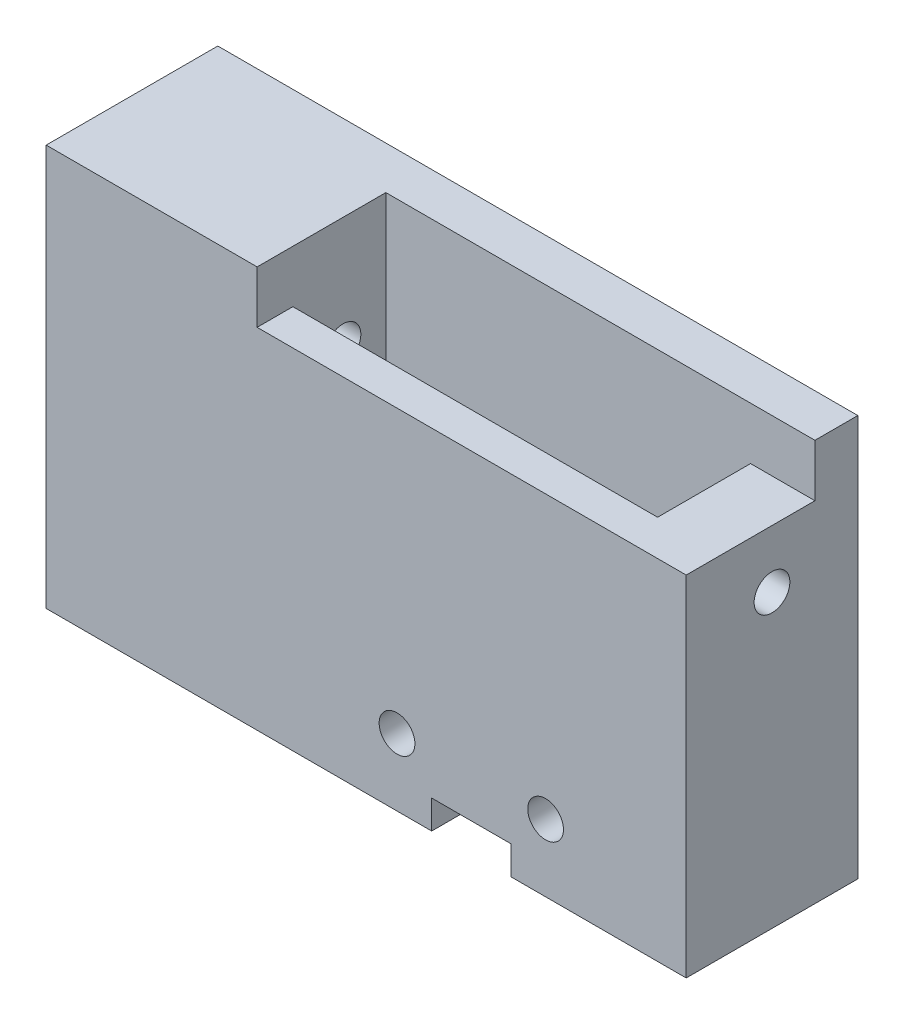
ISO-10303-21;
HEADER;
FILE_DESCRIPTION(('STEP AP214'),'2;1');
FILE_NAME('part.step','',(''),(''),'','','');
FILE_SCHEMA(('AUTOMOTIVE_DESIGN { 1 0 10303 214 1 1 1 1 }'));
ENDSEC;
DATA;
#1=APPLICATION_CONTEXT('core data for automotive mechanical design processes');
#2=APPLICATION_PROTOCOL_DEFINITION('international standard','automotive_design',2000,#1);
#3=PRODUCT_CONTEXT('',#1,'mechanical');
#4=PRODUCT('Part','Part','',(#3));
#5=PRODUCT_RELATED_PRODUCT_CATEGORY('part','',(#4));
#6=PRODUCT_DEFINITION_FORMATION('','',#4);
#7=PRODUCT_DEFINITION_CONTEXT('part definition',#1,'design');
#8=PRODUCT_DEFINITION('design','',#6,#7);
#9=PRODUCT_DEFINITION_SHAPE('','',#8);
#10=(LENGTH_UNIT() NAMED_UNIT(*) SI_UNIT(.MILLI.,.METRE.));
#11=(NAMED_UNIT(*) PLANE_ANGLE_UNIT() SI_UNIT($,.RADIAN.));
#12=(NAMED_UNIT(*) SI_UNIT($,.STERADIAN.) SOLID_ANGLE_UNIT());
#13=UNCERTAINTY_MEASURE_WITH_UNIT(LENGTH_MEASURE(1.E-05),#10,'distance_accuracy_value','');
#14=(GEOMETRIC_REPRESENTATION_CONTEXT(3) GLOBAL_UNCERTAINTY_ASSIGNED_CONTEXT((#13)) GLOBAL_UNIT_ASSIGNED_CONTEXT((#10,
#11,#12)) REPRESENTATION_CONTEXT('',''));
#15=CARTESIAN_POINT('',(0.,0.,0.));
#16=DIRECTION('',(0.,0.,1.));
#17=DIRECTION('',(1.,0.,0.));
#18=AXIS2_PLACEMENT_3D('',#15,#16,#17);
#19=CARTESIAN_POINT('',(-5.28,0.,9.));
#20=DIRECTION('',(1.,0.,0.));
#21=DIRECTION('',(0.,1.,0.));
#22=AXIS2_PLACEMENT_3D('',#19,#20,#21);
#23=PLANE('',#22);
#24=DIRECTION('',(0.,0.,-1.));
#25=VECTOR('',#24,1.);
#26=CARTESIAN_POINT('',(-5.28,6.3,9.));
#27=LINE('',#26,#25);
#28=CARTESIAN_POINT('',(-5.28,6.3,6.5));
#29=VERTEX_POINT('',#28);
#30=CARTESIAN_POINT('',(-5.28,6.3,0.));
#31=VERTEX_POINT('',#30);
#32=EDGE_CURVE('E274',#29,#31,#27,.T.);
#33=ORIENTED_EDGE('',*,*,#32,.F.);
#34=DIRECTION('',(0.,-1.,0.));
#35=VECTOR('',#34,1.);
#36=CARTESIAN_POINT('',(-5.28,0.,6.5));
#37=LINE('',#36,#35);
#38=CARTESIAN_POINT('',(-5.28,-4.7,6.5));
#39=VERTEX_POINT('',#38);
#40=EDGE_CURVE('E196',#29,#39,#37,.T.);
#41=ORIENTED_EDGE('',*,*,#40,.T.);
#42=DIRECTION('',(0.,0.,-1.));
#43=VECTOR('',#42,1.);
#44=CARTESIAN_POINT('',(-5.28,-4.7,9.));
#45=LINE('',#44,#43);
#46=CARTESIAN_POINT('',(-5.28,-4.7,0.));
#47=VERTEX_POINT('',#46);
#48=EDGE_CURVE('E173',#39,#47,#45,.T.);
#49=ORIENTED_EDGE('',*,*,#48,.T.);
#50=DIRECTION('',(0.,-1.,0.));
#51=VECTOR('',#50,1.);
#52=CARTESIAN_POINT('',(-5.28,0.,0.));
#53=LINE('',#52,#51);
#54=EDGE_CURVE('E263',#31,#47,#53,.T.);
#55=ORIENTED_EDGE('',*,*,#54,.F.);
#56=EDGE_LOOP('',(#33,#41,#49,#55));
#57=FACE_BOUND('',#56,.T.);
#58=ADVANCED_FACE('F35',(#57),#23,.T.);
#59=CARTESIAN_POINT('',(0.,6.3,9.));
#60=DIRECTION('',(0.,-1.,0.));
#61=DIRECTION('',(1.,0.,0.));
#62=AXIS2_PLACEMENT_3D('',#59,#60,#61);
#63=PLANE('',#62);
#64=DIRECTION('',(-1.,0.,0.));
#65=VECTOR('',#64,1.);
#66=CARTESIAN_POINT('',(0.,6.3,6.5));
#67=LINE('',#66,#65);
#68=CARTESIAN_POINT('',(-9.78,6.3,6.5));
#69=VERTEX_POINT('',#68);
#70=EDGE_CURVE('E194',#29,#69,#67,.T.);
#71=ORIENTED_EDGE('',*,*,#70,.F.);
#72=ORIENTED_EDGE('',*,*,#32,.T.);
#73=DIRECTION('',(-1.,0.,0.));
#74=VECTOR('',#73,1.);
#75=CARTESIAN_POINT('',(0.,6.3,0.));
#76=LINE('',#75,#74);
#77=CARTESIAN_POINT('',(-9.78,6.3,0.));
#78=VERTEX_POINT('',#77);
#79=EDGE_CURVE('E266',#31,#78,#76,.T.);
#80=ORIENTED_EDGE('',*,*,#79,.T.);
#81=DIRECTION('',(0.,0.,-1.));
#82=VECTOR('',#81,1.);
#83=CARTESIAN_POINT('',(-9.78,6.3,9.));
#84=LINE('',#83,#82);
#85=EDGE_CURVE('E272',#69,#78,#84,.T.);
#86=ORIENTED_EDGE('',*,*,#85,.F.);
#87=EDGE_LOOP('',(#71,#72,#80,#86));
#88=FACE_BOUND('',#87,.T.);
#89=ADVANCED_FACE('F324',(#88),#63,.F.);
#90=CARTESIAN_POINT('',(15.72,0.,9.));
#91=DIRECTION('',(-1.,0.,0.));
#92=DIRECTION('',(0.,-1.,0.));
#93=AXIS2_PLACEMENT_3D('',#90,#91,#92);
#94=PLANE('',#93);
#95=CARTESIAN_POINT('',(15.72,15.66,3.));
#96=DIRECTION('',(-1.,0.,0.));
#97=DIRECTION('',(0.,-1.,0.));
#98=AXIS2_PLACEMENT_3D('',#95,#96,#97);
#99=CIRCLE('',#98,1.25);
#100=CARTESIAN_POINT('',(15.72,14.41,3.));
#101=VERTEX_POINT('',#100);
#102=EDGE_CURVE('E227',#101,#101,#99,.T.);
#103=ORIENTED_EDGE('',*,*,#102,.F.);
#104=EDGE_LOOP('',(#103));
#105=FACE_BOUND('',#104,.T.);
#106=DIRECTION('',(0.,0.,-1.));
#107=VECTOR('',#106,1.);
#108=CARTESIAN_POINT('',(15.72,-4.7,9.));
#109=LINE('',#108,#107);
#110=CARTESIAN_POINT('',(15.72,-4.7,6.5));
#111=VERTEX_POINT('',#110);
#112=CARTESIAN_POINT('',(15.72,-4.7,0.));
#113=VERTEX_POINT('',#112);
#114=EDGE_CURVE('E51',#111,#113,#109,.T.);
#115=ORIENTED_EDGE('',*,*,#114,.F.);
#116=DIRECTION('',(0.,1.,0.));
#117=VECTOR('',#116,1.);
#118=CARTESIAN_POINT('',(15.72,0.,6.5));
#119=LINE('',#118,#117);
#120=CARTESIAN_POINT('',(15.72,19.7,6.5));
#121=VERTEX_POINT('',#120);
#122=EDGE_CURVE('E55',#111,#121,#119,.T.);
#123=ORIENTED_EDGE('',*,*,#122,.T.);
#124=DIRECTION('',(0.,0.,-1.));
#125=VECTOR('',#124,1.);
#126=CARTESIAN_POINT('',(15.72,19.7,9.));
#127=LINE('',#126,#125);
#128=CARTESIAN_POINT('',(15.72,19.7,0.));
#129=VERTEX_POINT('',#128);
#130=EDGE_CURVE('E254',#121,#129,#127,.T.);
#131=ORIENTED_EDGE('',*,*,#130,.T.);
#132=DIRECTION('',(0.,1.,0.));
#133=VECTOR('',#132,1.);
#134=CARTESIAN_POINT('',(15.72,0.,0.));
#135=LINE('',#134,#133);
#136=EDGE_CURVE('E234',#113,#129,#135,.T.);
#137=ORIENTED_EDGE('',*,*,#136,.F.);
#138=EDGE_LOOP('',(#115,#123,#131,#137));
#139=FACE_BOUND('',#138,.T.);
#140=ADVANCED_FACE('F357',(#105,#139),#94,.T.);
#141=CARTESIAN_POINT('',(0.,0.,0.));
#142=DIRECTION('',(0.,0.,1.));
#143=DIRECTION('',(1.,0.,0.));
#144=AXIS2_PLACEMENT_3D('',#141,#142,#143);
#145=PLANE('',#144);
#146=CARTESIAN_POINT('',(0.,0.,0.));
#147=DIRECTION('',(0.,0.,1.));
#148=DIRECTION('',(1.,0.,0.));
#149=AXIS2_PLACEMENT_3D('',#146,#147,#148);
#150=CIRCLE('',#149,1.25);
#151=CARTESIAN_POINT('',(1.25,0.,0.));
#152=VERTEX_POINT('',#151);
#153=EDGE_CURVE('E292',#152,#152,#150,.T.);
#154=ORIENTED_EDGE('',*,*,#153,.F.);
#155=EDGE_LOOP('',(#154));
#156=FACE_BOUND('',#155,.T.);
#157=CARTESIAN_POINT('',(10.39,0.,0.));
#158=DIRECTION('',(0.,0.,1.));
#159=DIRECTION('',(1.,0.,0.));
#160=AXIS2_PLACEMENT_3D('',#157,#158,#159);
#161=CIRCLE('',#160,1.25);
#162=CARTESIAN_POINT('',(11.64,0.,0.));
#163=VERTEX_POINT('',#162);
#164=EDGE_CURVE('E284',#163,#163,#161,.T.);
#165=ORIENTED_EDGE('',*,*,#164,.F.);
#166=EDGE_LOOP('',(#165));
#167=FACE_BOUND('',#166,.T.);
#168=DIRECTION('',(1.,0.,0.));
#169=VECTOR('',#168,1.);
#170=CARTESIAN_POINT('',(0.,23.36,0.));
#171=LINE('',#170,#169);
#172=CARTESIAN_POINT('',(-9.78,23.36,0.));
#173=VERTEX_POINT('',#172);
#174=CARTESIAN_POINT('',(20.22,23.36,0.));
#175=VERTEX_POINT('',#174);
#176=EDGE_CURVE('E276',#173,#175,#171,.T.);
#177=ORIENTED_EDGE('',*,*,#176,.F.);
#178=DIRECTION('',(0.,1.,0.));
#179=VECTOR('',#178,1.);
#180=CARTESIAN_POINT('',(-9.78,0.,0.));
#181=LINE('',#180,#179);
#182=EDGE_CURVE('E231',#78,#173,#181,.T.);
#183=ORIENTED_EDGE('',*,*,#182,.F.);
#184=ORIENTED_EDGE('',*,*,#79,.F.);
#185=ORIENTED_EDGE('',*,*,#54,.T.);
#186=DIRECTION('',(-1.,0.,0.));
#187=VECTOR('',#186,1.);
#188=CARTESIAN_POINT('',(0.,-4.7,0.));
#189=LINE('',#188,#187);
#190=EDGE_CURVE('E307',#113,#47,#189,.T.);
#191=ORIENTED_EDGE('',*,*,#190,.F.);
#192=ORIENTED_EDGE('',*,*,#136,.T.);
#193=DIRECTION('',(1.,0.,0.));
#194=VECTOR('',#193,1.);
#195=CARTESIAN_POINT('',(0.,19.7,0.));
#196=LINE('',#195,#194);
#197=CARTESIAN_POINT('',(20.22,19.7,0.));
#198=VERTEX_POINT('',#197);
#199=EDGE_CURVE('E248',#129,#198,#196,.T.);
#200=ORIENTED_EDGE('',*,*,#199,.T.);
#201=DIRECTION('',(0.,-1.,0.));
#202=VECTOR('',#201,1.);
#203=CARTESIAN_POINT('',(20.22,0.,0.));
#204=LINE('',#203,#202);
#205=EDGE_CURVE('E303',#175,#198,#204,.T.);
#206=ORIENTED_EDGE('',*,*,#205,.F.);
#207=EDGE_LOOP('',(#177,#183,#184,#185,#191,#192,#200,#206));
#208=FACE_BOUND('',#207,.T.);
#209=ADVANCED_FACE('F316',(#156,#167,#208),#145,.T.);
#210=CARTESIAN_POINT('',(20.22,0.,-3.));
#211=DIRECTION('',(-1.,0.,0.));
#212=DIRECTION('',(0.,0.,1.));
#213=AXIS2_PLACEMENT_3D('',#210,#211,#212);
#214=PLANE('',#213);
#215=CARTESIAN_POINT('',(20.22,15.66,3.));
#216=DIRECTION('',(-1.,0.,0.));
#217=DIRECTION('',(0.,0.,1.));
#218=AXIS2_PLACEMENT_3D('',#215,#216,#217);
#219=CIRCLE('',#218,1.25);
#220=CARTESIAN_POINT('',(20.22,15.66,4.25));
#221=VERTEX_POINT('',#220);
#222=EDGE_CURVE('E224',#221,#221,#219,.T.);
#223=ORIENTED_EDGE('',*,*,#222,.T.);
#224=EDGE_LOOP('',(#223));
#225=FACE_BOUND('',#224,.T.);
#226=ORIENTED_EDGE('',*,*,#205,.T.);
#227=DIRECTION('',(0.,0.,-1.));
#228=VECTOR('',#227,1.);
#229=CARTESIAN_POINT('',(20.22,19.7,9.));
#230=LINE('',#229,#228);
#231=CARTESIAN_POINT('',(20.22,19.7,9.));
#232=VERTEX_POINT('',#231);
#233=EDGE_CURVE('E260',#232,#198,#230,.T.);
#234=ORIENTED_EDGE('',*,*,#233,.F.);
#235=DIRECTION('',(0.,-1.,0.));
#236=VECTOR('',#235,1.);
#237=CARTESIAN_POINT('',(20.22,0.,9.));
#238=LINE('',#237,#236);
#239=CARTESIAN_POINT('',(20.22,-4.7,9.));
#240=VERTEX_POINT('',#239);
#241=EDGE_CURVE('E247',#232,#240,#238,.T.);
#242=ORIENTED_EDGE('',*,*,#241,.T.);
#243=DIRECTION('',(0.,0.,1.));
#244=VECTOR('',#243,1.);
#245=CARTESIAN_POINT('',(20.22,-4.7,-3.));
#246=LINE('',#245,#244);
#247=CARTESIAN_POINT('',(20.22,-4.7,-3.));
#248=VERTEX_POINT('',#247);
#249=EDGE_CURVE('E11',#248,#240,#246,.T.);
#250=ORIENTED_EDGE('',*,*,#249,.F.);
#251=DIRECTION('',(0.,-1.,0.));
#252=VECTOR('',#251,1.);
#253=CARTESIAN_POINT('',(20.22,0.,-3.));
#254=LINE('',#253,#252);
#255=CARTESIAN_POINT('',(20.22,23.36,-3.));
#256=VERTEX_POINT('',#255);
#257=EDGE_CURVE('E304',#256,#248,#254,.T.);
#258=ORIENTED_EDGE('',*,*,#257,.F.);
#259=DIRECTION('',(0.,0.,1.));
#260=VECTOR('',#259,1.);
#261=CARTESIAN_POINT('',(20.22,23.36,-55.8197510406855));
#262=LINE('',#261,#260);
#263=EDGE_CURVE('E286',#256,#175,#262,.T.);
#264=ORIENTED_EDGE('',*,*,#263,.T.);
#265=EDGE_LOOP('',(#226,#234,#242,#250,#258,#264));
#266=FACE_BOUND('',#265,.T.);
#267=ADVANCED_FACE('F37',(#225,#266),#214,.F.);
#268=CARTESIAN_POINT('',(0.,-4.7,-3.));
#269=DIRECTION('',(0.,1.,0.));
#270=DIRECTION('',(-1.,0.,0.));
#271=AXIS2_PLACEMENT_3D('',#268,#269,#270);
#272=PLANE('',#271);
#273=DIRECTION('',(-1.,0.,0.));
#274=VECTOR('',#273,1.);
#275=CARTESIAN_POINT('',(0.,-4.7,9.));
#276=LINE('',#275,#274);
#277=CARTESIAN_POINT('',(2.425,-4.7,9.));
#278=VERTEX_POINT('',#277);
#279=CARTESIAN_POINT('',(-24.5299999999999,-4.7,9.));
#280=VERTEX_POINT('',#279);
#281=EDGE_CURVE('E264',#278,#280,#276,.T.);
#282=ORIENTED_EDGE('',*,*,#281,.T.);
#283=DIRECTION('',(0.,0.,1.));
#284=VECTOR('',#283,1.);
#285=CARTESIAN_POINT('',(-24.5299999999999,-4.7,-55.8197510406855));
#286=LINE('',#285,#284);
#287=CARTESIAN_POINT('',(-24.5299999999999,-4.7,-3.));
#288=VERTEX_POINT('',#287);
#289=EDGE_CURVE('E281',#288,#280,#286,.T.);
#290=ORIENTED_EDGE('',*,*,#289,.F.);
#291=DIRECTION('',(-1.,0.,0.));
#292=VECTOR('',#291,1.);
#293=CARTESIAN_POINT('',(0.,-4.7,-3.));
#294=LINE('',#293,#292);
#295=EDGE_CURVE('E44',#248,#288,#294,.T.);
#296=ORIENTED_EDGE('',*,*,#295,.F.);
#297=ORIENTED_EDGE('',*,*,#249,.T.);
#298=DIRECTION('',(-1.,0.,0.));
#299=VECTOR('',#298,1.);
#300=CARTESIAN_POINT('',(0.,-4.7,9.));
#301=LINE('',#300,#299);
#302=CARTESIAN_POINT('',(7.975,-4.7,9.));
#303=VERTEX_POINT('',#302);
#304=EDGE_CURVE('E245',#240,#303,#301,.T.);
#305=ORIENTED_EDGE('',*,*,#304,.T.);
#306=DIRECTION('',(0.,0.,-1.));
#307=VECTOR('',#306,1.);
#308=CARTESIAN_POINT('',(7.975,-4.7,44.2932004782791));
#309=LINE('',#308,#307);
#310=CARTESIAN_POINT('',(7.975,-4.7,6.5));
#311=VERTEX_POINT('',#310);
#312=EDGE_CURVE('E207',#303,#311,#309,.T.);
#313=ORIENTED_EDGE('',*,*,#312,.T.);
#314=DIRECTION('',(-1.,0.,0.));
#315=VECTOR('',#314,1.);
#316=CARTESIAN_POINT('',(0.,-4.7,6.5));
#317=LINE('',#316,#315);
#318=EDGE_CURVE('E184',#111,#311,#317,.T.);
#319=ORIENTED_EDGE('',*,*,#318,.F.);
#320=ORIENTED_EDGE('',*,*,#114,.T.);
#321=ORIENTED_EDGE('',*,*,#190,.T.);
#322=ORIENTED_EDGE('',*,*,#48,.F.);
#323=DIRECTION('',(-1.,0.,0.));
#324=VECTOR('',#323,1.);
#325=CARTESIAN_POINT('',(0.,-4.7,6.5));
#326=LINE('',#325,#324);
#327=CARTESIAN_POINT('',(2.425,-4.7,6.5));
#328=VERTEX_POINT('',#327);
#329=EDGE_CURVE('E164',#328,#39,#326,.T.);
#330=ORIENTED_EDGE('',*,*,#329,.F.);
#331=DIRECTION('',(0.,0.,-1.));
#332=VECTOR('',#331,1.);
#333=CARTESIAN_POINT('',(2.425,-4.7,44.2932004782791));
#334=LINE('',#333,#332);
#335=EDGE_CURVE('E147',#278,#328,#334,.T.);
#336=ORIENTED_EDGE('',*,*,#335,.F.);
#337=EDGE_LOOP('',(#282,#290,#296,#297,#305,#313,#319,#320,#321,#322,#330,#336));
#338=FACE_BOUND('',#337,.T.);
#339=ADVANCED_FACE('F171',(#338),#272,.F.);
#340=CARTESIAN_POINT('',(0.,0.,-3.));
#341=DIRECTION('',(0.,0.,1.));
#342=DIRECTION('',(1.,0.,0.));
#343=AXIS2_PLACEMENT_3D('',#340,#341,#342);
#344=PLANE('',#343);
#345=DIRECTION('',(-1.,0.,0.));
#346=VECTOR('',#345,1.);
#347=CARTESIAN_POINT('',(0.,23.36,-3.));
#348=LINE('',#347,#346);
#349=CARTESIAN_POINT('',(-24.5299999999999,23.36,-3.));
#350=VERTEX_POINT('',#349);
#351=EDGE_CURVE('E277',#256,#350,#348,.T.);
#352=ORIENTED_EDGE('',*,*,#351,.F.);
#353=ORIENTED_EDGE('',*,*,#257,.T.);
#354=ORIENTED_EDGE('',*,*,#295,.T.);
#355=DIRECTION('',(0.,-1.,0.));
#356=VECTOR('',#355,1.);
#357=CARTESIAN_POINT('',(-24.5299999999999,0.,-3.));
#358=LINE('',#357,#356);
#359=EDGE_CURVE('E280',#350,#288,#358,.T.);
#360=ORIENTED_EDGE('',*,*,#359,.F.);
#361=EDGE_LOOP('',(#352,#353,#354,#360));
#362=FACE_BOUND('',#361,.T.);
#363=CARTESIAN_POINT('',(10.39,0.,-3.));
#364=DIRECTION('',(0.,0.,1.));
#365=DIRECTION('',(1.,0.,0.));
#366=AXIS2_PLACEMENT_3D('',#363,#364,#365);
#367=CIRCLE('',#366,1.25);
#368=CARTESIAN_POINT('',(11.64,0.,-3.));
#369=VERTEX_POINT('',#368);
#370=EDGE_CURVE('E295',#369,#369,#367,.T.);
#371=ORIENTED_EDGE('',*,*,#370,.T.);
#372=EDGE_LOOP('',(#371));
#373=FACE_BOUND('',#372,.T.);
#374=CARTESIAN_POINT('',(0.,0.,-3.));
#375=DIRECTION('',(0.,0.,1.));
#376=DIRECTION('',(1.,0.,0.));
#377=AXIS2_PLACEMENT_3D('',#374,#375,#376);
#378=CIRCLE('',#377,1.25);
#379=CARTESIAN_POINT('',(1.25,0.,-3.));
#380=VERTEX_POINT('',#379);
#381=EDGE_CURVE('E300',#380,#380,#378,.T.);
#382=ORIENTED_EDGE('',*,*,#381,.T.);
#383=EDGE_LOOP('',(#382));
#384=FACE_BOUND('',#383,.T.);
#385=ADVANCED_FACE('F389',(#362,#373,#384),#344,.F.);
#386=CARTESIAN_POINT('',(10.39,0.,-6.));
#387=DIRECTION('',(0.,0.,1.));
#388=DIRECTION('',(1.,0.,0.));
#389=AXIS2_PLACEMENT_3D('',#386,#387,#388);
#390=CYLINDRICAL_SURFACE('',#389,1.25);
#391=ORIENTED_EDGE('',*,*,#164,.T.);
#392=EDGE_LOOP('',(#391));
#393=FACE_BOUND('',#392,.T.);
#394=ORIENTED_EDGE('',*,*,#370,.F.);
#395=EDGE_LOOP('',(#394));
#396=FACE_BOUND('',#395,.T.);
#397=ADVANCED_FACE('F385',(#393,#396),#390,.F.);
#398=CARTESIAN_POINT('',(0.,0.,-6.));
#399=DIRECTION('',(0.,0.,1.));
#400=DIRECTION('',(1.,0.,0.));
#401=AXIS2_PLACEMENT_3D('',#398,#399,#400);
#402=CYLINDRICAL_SURFACE('',#401,1.25);
#403=ORIENTED_EDGE('',*,*,#153,.T.);
#404=EDGE_LOOP('',(#403));
#405=FACE_BOUND('',#404,.T.);
#406=ORIENTED_EDGE('',*,*,#381,.F.);
#407=EDGE_LOOP('',(#406));
#408=FACE_BOUND('',#407,.T.);
#409=ADVANCED_FACE('F382',(#405,#408),#402,.F.);
#410=CARTESIAN_POINT('',(0.,23.36,-55.8197510406855));
#411=DIRECTION('',(0.,-1.,0.));
#412=DIRECTION('',(0.,0.,-1.));
#413=AXIS2_PLACEMENT_3D('',#410,#411,#412);
#414=PLANE('',#413);
#415=ORIENTED_EDGE('',*,*,#263,.F.);
#416=ORIENTED_EDGE('',*,*,#351,.T.);
#417=DIRECTION('',(0.,0.,1.));
#418=VECTOR('',#417,1.);
#419=CARTESIAN_POINT('',(-24.5299999999999,23.36,-55.8197510406855));
#420=LINE('',#419,#418);
#421=CARTESIAN_POINT('',(-24.5299999999999,23.36,9.));
#422=VERTEX_POINT('',#421);
#423=EDGE_CURVE('E288',#350,#422,#420,.T.);
#424=ORIENTED_EDGE('',*,*,#423,.T.);
#425=DIRECTION('',(1.,0.,0.));
#426=VECTOR('',#425,1.);
#427=CARTESIAN_POINT('',(0.,23.36,9.));
#428=LINE('',#427,#426);
#429=CARTESIAN_POINT('',(-9.78,23.36,9.));
#430=VERTEX_POINT('',#429);
#431=EDGE_CURVE('E239',#422,#430,#428,.T.);
#432=ORIENTED_EDGE('',*,*,#431,.T.);
#433=DIRECTION('',(0.,0.,-1.));
#434=VECTOR('',#433,1.);
#435=CARTESIAN_POINT('',(-9.78,23.36,40.7005693955171));
#436=LINE('',#435,#434);
#437=EDGE_CURVE('E235',#430,#173,#436,.T.);
#438=ORIENTED_EDGE('',*,*,#437,.T.);
#439=ORIENTED_EDGE('',*,*,#176,.T.);
#440=EDGE_LOOP('',(#415,#416,#424,#432,#438,#439));
#441=FACE_BOUND('',#440,.T.);
#442=ADVANCED_FACE('F332',(#441),#414,.F.);
#443=CARTESIAN_POINT('',(-24.5299999999999,0.,-55.8197510406855));
#444=DIRECTION('',(1.,0.,0.));
#445=DIRECTION('',(0.,0.,-1.));
#446=AXIS2_PLACEMENT_3D('',#443,#444,#445);
#447=PLANE('',#446);
#448=CARTESIAN_POINT('',(-24.5299999999999,15.66,3.));
#449=DIRECTION('',(-1.,0.,0.));
#450=DIRECTION('',(0.,0.,1.));
#451=AXIS2_PLACEMENT_3D('',#448,#449,#450);
#452=CIRCLE('',#451,5.);
#453=CARTESIAN_POINT('',(-24.5299999999999,15.66,8.));
#454=VERTEX_POINT('',#453);
#455=EDGE_CURVE('E158',#454,#454,#452,.T.);
#456=ORIENTED_EDGE('',*,*,#455,.F.);
#457=EDGE_LOOP('',(#456));
#458=FACE_BOUND('',#457,.T.);
#459=ORIENTED_EDGE('',*,*,#423,.F.);
#460=ORIENTED_EDGE('',*,*,#359,.T.);
#461=ORIENTED_EDGE('',*,*,#289,.T.);
#462=DIRECTION('',(0.,1.,0.));
#463=VECTOR('',#462,1.);
#464=CARTESIAN_POINT('',(-24.5299999999999,0.,9.));
#465=LINE('',#464,#463);
#466=EDGE_CURVE('E236',#280,#422,#465,.T.);
#467=ORIENTED_EDGE('',*,*,#466,.T.);
#468=EDGE_LOOP('',(#459,#460,#461,#467));
#469=FACE_BOUND('',#468,.T.);
#470=ADVANCED_FACE('F376',(#458,#469),#447,.F.);
#471=CARTESIAN_POINT('',(0.,0.,9.));
#472=DIRECTION('',(0.,0.,1.));
#473=DIRECTION('',(1.,0.,0.));
#474=AXIS2_PLACEMENT_3D('',#471,#472,#473);
#475=PLANE('',#474);
#476=ORIENTED_EDGE('',*,*,#281,.F.);
#477=DIRECTION('',(0.,1.,0.));
#478=VECTOR('',#477,1.);
#479=CARTESIAN_POINT('',(2.425,0.,9.));
#480=LINE('',#479,#478);
#481=CARTESIAN_POINT('',(2.425,-2.7,9.));
#482=VERTEX_POINT('',#481);
#483=EDGE_CURVE('E154',#278,#482,#480,.T.);
#484=ORIENTED_EDGE('',*,*,#483,.T.);
#485=DIRECTION('',(1.,0.,0.));
#486=VECTOR('',#485,1.);
#487=CARTESIAN_POINT('',(0.,-2.7,9.));
#488=LINE('',#487,#486);
#489=CARTESIAN_POINT('',(7.975,-2.7,9.));
#490=VERTEX_POINT('',#489);
#491=EDGE_CURVE('E352',#482,#490,#488,.T.);
#492=ORIENTED_EDGE('',*,*,#491,.T.);
#493=DIRECTION('',(0.,-1.,0.));
#494=VECTOR('',#493,1.);
#495=CARTESIAN_POINT('',(7.975,0.,9.));
#496=LINE('',#495,#494);
#497=EDGE_CURVE('E215',#490,#303,#496,.T.);
#498=ORIENTED_EDGE('',*,*,#497,.T.);
#499=ORIENTED_EDGE('',*,*,#304,.F.);
#500=ORIENTED_EDGE('',*,*,#241,.F.);
#501=DIRECTION('',(1.,0.,0.));
#502=VECTOR('',#501,1.);
#503=CARTESIAN_POINT('',(0.,19.7,9.));
#504=LINE('',#503,#502);
#505=CARTESIAN_POINT('',(-9.78,19.7,9.));
#506=VERTEX_POINT('',#505);
#507=EDGE_CURVE('E251',#506,#232,#504,.T.);
#508=ORIENTED_EDGE('',*,*,#507,.F.);
#509=DIRECTION('',(0.,1.,0.));
#510=VECTOR('',#509,1.);
#511=CARTESIAN_POINT('',(-9.78,0.,9.));
#512=LINE('',#511,#510);
#513=EDGE_CURVE('E230',#506,#430,#512,.T.);
#514=ORIENTED_EDGE('',*,*,#513,.T.);
#515=ORIENTED_EDGE('',*,*,#431,.F.);
#516=ORIENTED_EDGE('',*,*,#466,.F.);
#517=EDGE_LOOP('',(#476,#484,#492,#498,#499,#500,#508,#514,#515,#516));
#518=FACE_BOUND('',#517,.T.);
#519=CARTESIAN_POINT('',(10.39,0.,9.));
#520=DIRECTION('',(0.,0.,1.));
#521=DIRECTION('',(1.,0.,0.));
#522=AXIS2_PLACEMENT_3D('',#519,#520,#521);
#523=CIRCLE('',#522,1.25);
#524=CARTESIAN_POINT('',(11.64,0.,9.));
#525=VERTEX_POINT('',#524);
#526=EDGE_CURVE('E174',#525,#525,#523,.T.);
#527=ORIENTED_EDGE('',*,*,#526,.F.);
#528=EDGE_LOOP('',(#527));
#529=FACE_BOUND('',#528,.T.);
#530=CARTESIAN_POINT('',(0.,0.,9.));
#531=DIRECTION('',(0.,0.,1.));
#532=DIRECTION('',(1.,0.,0.));
#533=AXIS2_PLACEMENT_3D('',#530,#531,#532);
#534=CIRCLE('',#533,1.25);
#535=CARTESIAN_POINT('',(1.25,0.,9.));
#536=VERTEX_POINT('',#535);
#537=EDGE_CURVE('E212',#536,#536,#534,.T.);
#538=ORIENTED_EDGE('',*,*,#537,.F.);
#539=EDGE_LOOP('',(#538));
#540=FACE_BOUND('',#539,.T.);
#541=ADVANCED_FACE('F336',(#518,#529,#540),#475,.T.);
#542=CARTESIAN_POINT('',(0.,19.7,9.));
#543=DIRECTION('',(0.,1.,0.));
#544=DIRECTION('',(0.,0.,1.));
#545=AXIS2_PLACEMENT_3D('',#542,#543,#544);
#546=PLANE('',#545);
#547=ORIENTED_EDGE('',*,*,#199,.F.);
#548=ORIENTED_EDGE('',*,*,#130,.F.);
#549=DIRECTION('',(1.,0.,0.));
#550=VECTOR('',#549,1.);
#551=CARTESIAN_POINT('',(0.,19.7,6.5));
#552=LINE('',#551,#550);
#553=CARTESIAN_POINT('',(-9.78,19.7,6.5));
#554=VERTEX_POINT('',#553);
#555=EDGE_CURVE('E188',#554,#121,#552,.T.);
#556=ORIENTED_EDGE('',*,*,#555,.F.);
#557=DIRECTION('',(0.,0.,-1.));
#558=VECTOR('',#557,1.);
#559=CARTESIAN_POINT('',(-9.78,19.7,44.2932004782791));
#560=LINE('',#559,#558);
#561=EDGE_CURVE('E204',#506,#554,#560,.T.);
#562=ORIENTED_EDGE('',*,*,#561,.F.);
#563=ORIENTED_EDGE('',*,*,#507,.T.);
#564=ORIENTED_EDGE('',*,*,#233,.T.);
#565=EDGE_LOOP('',(#547,#548,#556,#562,#563,#564));
#566=FACE_BOUND('',#565,.T.);
#567=ADVANCED_FACE('F343',(#566),#546,.T.);
#568=CARTESIAN_POINT('',(-9.78,0.,40.7005693955171));
#569=DIRECTION('',(-1.,0.,0.));
#570=DIRECTION('',(0.,0.,1.));
#571=AXIS2_PLACEMENT_3D('',#568,#569,#570);
#572=PLANE('',#571);
#573=CARTESIAN_POINT('',(-9.78,15.66,3.));
#574=DIRECTION('',(-1.,0.,0.));
#575=DIRECTION('',(0.,0.,1.));
#576=AXIS2_PLACEMENT_3D('',#573,#574,#575);
#577=CIRCLE('',#576,1.25);
#578=CARTESIAN_POINT('',(-9.78,15.66,4.25));
#579=VERTEX_POINT('',#578);
#580=EDGE_CURVE('E39',#579,#579,#577,.T.);
#581=ORIENTED_EDGE('',*,*,#580,.T.);
#582=EDGE_LOOP('',(#581));
#583=FACE_BOUND('',#582,.T.);
#584=ORIENTED_EDGE('',*,*,#513,.F.);
#585=ORIENTED_EDGE('',*,*,#561,.T.);
#586=DIRECTION('',(0.,1.,0.));
#587=VECTOR('',#586,1.);
#588=CARTESIAN_POINT('',(-9.78,0.,6.5));
#589=LINE('',#588,#587);
#590=EDGE_CURVE('E191',#69,#554,#589,.T.);
#591=ORIENTED_EDGE('',*,*,#590,.F.);
#592=ORIENTED_EDGE('',*,*,#85,.T.);
#593=ORIENTED_EDGE('',*,*,#182,.T.);
#594=ORIENTED_EDGE('',*,*,#437,.F.);
#595=EDGE_LOOP('',(#584,#585,#591,#592,#593,#594));
#596=FACE_BOUND('',#595,.T.);
#597=ADVANCED_FACE('F327',(#583,#596),#572,.F.);
#598=CARTESIAN_POINT('',(-13.5279670038566,15.66,3.));
#599=DIRECTION('',(-1.,0.,0.));
#600=DIRECTION('',(0.,0.,1.));
#601=AXIS2_PLACEMENT_3D('',#598,#599,#600);
#602=CYLINDRICAL_SURFACE('',#601,5.);
#603=CARTESIAN_POINT('',(-18.5299999999999,15.66,3.));
#604=DIRECTION('',(-1.,0.,0.));
#605=DIRECTION('',(0.,0.,1.));
#606=AXIS2_PLACEMENT_3D('',#603,#604,#605);
#607=CIRCLE('',#606,5.);
#608=CARTESIAN_POINT('',(-18.5299999999999,15.66,8.));
#609=VERTEX_POINT('',#608);
#610=EDGE_CURVE('E218',#609,#609,#607,.T.);
#611=ORIENTED_EDGE('',*,*,#610,.F.);
#612=EDGE_LOOP('',(#611));
#613=FACE_BOUND('',#612,.T.);
#614=ORIENTED_EDGE('',*,*,#455,.T.);
#615=EDGE_LOOP('',(#614));
#616=FACE_BOUND('',#615,.T.);
#617=ADVANCED_FACE('F420',(#613,#616),#602,.F.);
#618=CARTESIAN_POINT('',(-18.5299999999999,15.66,3.));
#619=DIRECTION('',(-1.,0.,0.));
#620=DIRECTION('',(0.,0.,1.));
#621=AXIS2_PLACEMENT_3D('',#618,#619,#620);
#622=CONICAL_SURFACE('',#621,5.,0.785398163397459);
#623=CARTESIAN_POINT('',(-14.78,15.66,3.));
#624=DIRECTION('',(-1.,0.,0.));
#625=DIRECTION('',(0.,0.,1.));
#626=AXIS2_PLACEMENT_3D('',#623,#624,#625);
#627=CIRCLE('',#626,1.24999999999999);
#628=CARTESIAN_POINT('',(-14.78,15.66,4.24999999999999));
#629=VERTEX_POINT('',#628);
#630=EDGE_CURVE('E221',#629,#629,#627,.T.);
#631=CARTESIAN_POINT('',(-14.78,15.66,4.24999999999999));
#632=CARTESIAN_POINT('',(-14.8190625,15.66,4.28906249999999));
#633=CARTESIAN_POINT('',(-14.858125,15.66,4.32812499999999));
#634=CARTESIAN_POINT('',(-14.93625,15.66,4.40624999999999));
#635=CARTESIAN_POINT('',(-14.9753125,15.66,4.44531249999999));
#636=CARTESIAN_POINT('',(-15.0534375,15.66,4.52343749999999));
#637=CARTESIAN_POINT('',(-15.0925,15.66,4.56249999999999));
#638=CARTESIAN_POINT('',(-15.170625,15.66,4.64062499999999));
#639=CARTESIAN_POINT('',(-15.2096875,15.66,4.67968749999999));
#640=CARTESIAN_POINT('',(-15.2878125,15.66,4.75781249999999));
#641=CARTESIAN_POINT('',(-15.326875,15.66,4.79687499999999));
#642=CARTESIAN_POINT('',(-15.405,15.66,4.87499999999999));
#643=CARTESIAN_POINT('',(-15.4440625,15.66,4.91406249999999));
#644=CARTESIAN_POINT('',(-15.5221875,15.66,4.99218749999999));
#645=CARTESIAN_POINT('',(-15.56125,15.66,5.03124999999999));
#646=CARTESIAN_POINT('',(-15.639375,15.66,5.10937499999999));
#647=CARTESIAN_POINT('',(-15.6784375,15.66,5.1484375));
#648=CARTESIAN_POINT('',(-15.7565625,15.66,5.2265625));
#649=CARTESIAN_POINT('',(-15.795625,15.66,5.265625));
#650=CARTESIAN_POINT('',(-15.87375,15.66,5.34375));
#651=CARTESIAN_POINT('',(-15.9128125,15.66,5.3828125));
#652=CARTESIAN_POINT('',(-15.9909375,15.66,5.4609375));
#653=CARTESIAN_POINT('',(-16.03,15.66,5.5));
#654=CARTESIAN_POINT('',(-16.108125,15.66,5.578125));
#655=CARTESIAN_POINT('',(-16.1471875,15.66,5.6171875));
#656=CARTESIAN_POINT('',(-16.2253125,15.66,5.6953125));
#657=CARTESIAN_POINT('',(-16.264375,15.66,5.734375));
#658=CARTESIAN_POINT('',(-16.3425,15.66,5.8125));
#659=CARTESIAN_POINT('',(-16.3815625,15.66,5.8515625));
#660=CARTESIAN_POINT('',(-16.4596875,15.66,5.9296875));
#661=CARTESIAN_POINT('',(-16.49875,15.66,5.96875));
#662=CARTESIAN_POINT('',(-16.576875,15.66,6.046875));
#663=CARTESIAN_POINT('',(-16.6159375,15.66,6.0859375));
#664=CARTESIAN_POINT('',(-16.6940625,15.66,6.1640625));
#665=CARTESIAN_POINT('',(-16.733125,15.66,6.203125));
#666=CARTESIAN_POINT('',(-16.81125,15.66,6.28125));
#667=CARTESIAN_POINT('',(-16.8503125,15.66,6.3203125));
#668=CARTESIAN_POINT('',(-16.9284375,15.66,6.3984375));
#669=CARTESIAN_POINT('',(-16.9675,15.66,6.4375));
#670=CARTESIAN_POINT('',(-17.045625,15.66,6.515625));
#671=CARTESIAN_POINT('',(-17.0846875,15.66,6.5546875));
#672=CARTESIAN_POINT('',(-17.1628125,15.66,6.6328125));
#673=CARTESIAN_POINT('',(-17.201875,15.66,6.671875));
#674=CARTESIAN_POINT('',(-17.28,15.66,6.75));
#675=CARTESIAN_POINT('',(-17.3190625,15.66,6.7890625));
#676=CARTESIAN_POINT('',(-17.3971875,15.66,6.8671875));
#677=CARTESIAN_POINT('',(-17.43625,15.66,6.90625));
#678=CARTESIAN_POINT('',(-17.514375,15.66,6.984375));
#679=CARTESIAN_POINT('',(-17.5534375,15.66,7.0234375));
#680=CARTESIAN_POINT('',(-17.6315625,15.66,7.1015625));
#681=CARTESIAN_POINT('',(-17.670625,15.66,7.140625));
#682=CARTESIAN_POINT('',(-17.7487499999999,15.66,7.21875));
#683=CARTESIAN_POINT('',(-17.7878124999999,15.66,7.2578125));
#684=CARTESIAN_POINT('',(-17.8659374999999,15.66,7.3359375));
#685=CARTESIAN_POINT('',(-17.9049999999999,15.66,7.375));
#686=CARTESIAN_POINT('',(-17.9831249999999,15.66,7.453125));
#687=CARTESIAN_POINT('',(-18.0221874999999,15.66,7.4921875));
#688=CARTESIAN_POINT('',(-18.1003124999999,15.66,7.5703125));
#689=CARTESIAN_POINT('',(-18.1393749999999,15.66,7.609375));
#690=CARTESIAN_POINT('',(-18.2174999999999,15.66,7.6875));
#691=CARTESIAN_POINT('',(-18.2565624999999,15.66,7.7265625));
#692=CARTESIAN_POINT('',(-18.3346874999999,15.66,7.8046875));
#693=CARTESIAN_POINT('',(-18.3737499999999,15.66,7.84375));
#694=CARTESIAN_POINT('',(-18.4518749999999,15.66,7.921875));
#695=CARTESIAN_POINT('',(-18.4909374999999,15.66,7.9609375));
#696=CARTESIAN_POINT('',(-18.5299999999999,15.66,8.));
#697=B_SPLINE_CURVE_WITH_KNOTS('',3,(#631,#632,#633,#634,#635,#636,#637,#638,#639,#640,#641,
#642,#643,#644,#645,#646,#647,#648,#649,#650,#651,#652,#653,#654,#655,#656,#657,#658,#659,#660,
#661,#662,#663,#664,#665,#666,#667,#668,#669,#670,#671,#672,#673,#674,#675,#676,#677,#678,#679,
#680,#681,#682,#683,#684,#685,#686,#687,#688,#689,#690,#691,#692,#693,#694,#695,#696),
.UNSPECIFIED.,.F.,.F.,(4,2,2,2,2,2,2,2,2,2,2,2,2,2,2,2,2,2,2,2,2,2,2,2,2,2,2,2,2,2,2,2,4),(0.,
0.165728151840597,0.331456303681192,0.497184455521787,0.662912607362383,0.82864075920298,
0.994368911043575,1.16009706288417,1.32582521472477,1.49155336656536,1.65728151840596,
1.82300967024655,1.98873782208715,2.15446597392775,2.32019412576834,2.48592227760894,
2.65165042944953,2.81737858129013,2.98310673313072,3.14883488497132,3.31456303681191,
3.48029118865251,3.64601934049311,3.8117474923337,3.9774756441743,4.14320379601489,
4.30893194785549,4.47466009969609,4.64038825153668,4.80611640337728,4.97184455521787,
5.13757270705847,5.30330085889907),.UNSPECIFIED.);
#698=EDGE_CURVE('BSEAM414',#629,#609,#697,.T.);
#699=ORIENTED_EDGE('',*,*,#630,.F.);
#700=ORIENTED_EDGE('',*,*,#610,.T.);
#701=ORIENTED_EDGE('',*,*,#698,.T.);
#702=ORIENTED_EDGE('',*,*,#698,.F.);
#703=EDGE_LOOP('',(#699,#701,#700,#702));
#704=FACE_BOUND('',#703,.T.);
#705=ADVANCED_FACE('F414',(#704),#622,.F.);
#706=CARTESIAN_POINT('',(-13.5279670038566,15.66,3.));
#707=DIRECTION('',(-1.,0.,0.));
#708=DIRECTION('',(0.,0.,1.));
#709=AXIS2_PLACEMENT_3D('',#706,#707,#708);
#710=CYLINDRICAL_SURFACE('',#709,1.25);
#711=ORIENTED_EDGE('',*,*,#630,.T.);
#712=EDGE_LOOP('',(#711));
#713=FACE_BOUND('',#712,.T.);
#714=ORIENTED_EDGE('',*,*,#580,.F.);
#715=EDGE_LOOP('',(#714));
#716=FACE_BOUND('',#715,.T.);
#717=ADVANCED_FACE('F405',(#713,#716),#710,.F.);
#718=ORIENTED_EDGE('',*,*,#102,.T.);
#719=EDGE_LOOP('',(#718));
#720=FACE_BOUND('',#719,.T.);
#721=ORIENTED_EDGE('',*,*,#222,.F.);
#722=EDGE_LOOP('',(#721));
#723=FACE_BOUND('',#722,.T.);
#724=ADVANCED_FACE('F402',(#720,#723),#710,.F.);
#725=CARTESIAN_POINT('',(10.39,0.,44.2932004782791));
#726=DIRECTION('',(0.,0.,-1.));
#727=DIRECTION('',(-1.,0.,0.));
#728=AXIS2_PLACEMENT_3D('',#725,#726,#727);
#729=CYLINDRICAL_SURFACE('',#728,1.25);
#730=CARTESIAN_POINT('',(10.39,0.,6.5));
#731=DIRECTION('',(0.,0.,1.));
#732=DIRECTION('',(1.,0.,0.));
#733=AXIS2_PLACEMENT_3D('',#730,#731,#732);
#734=CIRCLE('',#733,1.25);
#735=CARTESIAN_POINT('',(11.64,0.,6.5));
#736=VERTEX_POINT('',#735);
#737=EDGE_CURVE('E198',#736,#736,#734,.T.);
#738=ORIENTED_EDGE('',*,*,#737,.F.);
#739=EDGE_LOOP('',(#738));
#740=FACE_BOUND('',#739,.T.);
#741=ORIENTED_EDGE('',*,*,#526,.T.);
#742=EDGE_LOOP('',(#741));
#743=FACE_BOUND('',#742,.T.);
#744=ADVANCED_FACE('F404',(#740,#743),#729,.F.);
#745=CARTESIAN_POINT('',(7.975,0.,44.2932004782791));
#746=DIRECTION('',(1.,0.,0.));
#747=DIRECTION('',(0.,0.,-1.));
#748=AXIS2_PLACEMENT_3D('',#745,#746,#747);
#749=PLANE('',#748);
#750=ORIENTED_EDGE('',*,*,#497,.F.);
#751=DIRECTION('',(0.,0.,-1.));
#752=VECTOR('',#751,1.);
#753=CARTESIAN_POINT('',(7.975,-2.7,44.2932004782791));
#754=LINE('',#753,#752);
#755=CARTESIAN_POINT('',(7.975,-2.7,6.5));
#756=VERTEX_POINT('',#755);
#757=EDGE_CURVE('E209',#490,#756,#754,.T.);
#758=ORIENTED_EDGE('',*,*,#757,.T.);
#759=DIRECTION('',(0.,-1.,0.));
#760=VECTOR('',#759,1.);
#761=CARTESIAN_POINT('',(7.975,0.,6.5));
#762=LINE('',#761,#760);
#763=EDGE_CURVE('E181',#756,#311,#762,.T.);
#764=ORIENTED_EDGE('',*,*,#763,.T.);
#765=ORIENTED_EDGE('',*,*,#312,.F.);
#766=EDGE_LOOP('',(#750,#758,#764,#765));
#767=FACE_BOUND('',#766,.T.);
#768=ADVANCED_FACE('F347',(#767),#749,.F.);
#769=CARTESIAN_POINT('',(0.,-2.7,44.2932004782791));
#770=DIRECTION('',(0.,1.,0.));
#771=DIRECTION('',(0.,0.,1.));
#772=AXIS2_PLACEMENT_3D('',#769,#770,#771);
#773=PLANE('',#772);
#774=ORIENTED_EDGE('',*,*,#491,.F.);
#775=DIRECTION('',(0.,0.,-1.));
#776=VECTOR('',#775,1.);
#777=CARTESIAN_POINT('',(2.425,-2.7,44.2932004782791));
#778=LINE('',#777,#776);
#779=CARTESIAN_POINT('',(2.425,-2.7,6.5));
#780=VERTEX_POINT('',#779);
#781=EDGE_CURVE('E159',#482,#780,#778,.T.);
#782=ORIENTED_EDGE('',*,*,#781,.T.);
#783=DIRECTION('',(1.,0.,0.));
#784=VECTOR('',#783,1.);
#785=CARTESIAN_POINT('',(0.,-2.7,6.5));
#786=LINE('',#785,#784);
#787=EDGE_CURVE('E168',#780,#756,#786,.T.);
#788=ORIENTED_EDGE('',*,*,#787,.T.);
#789=ORIENTED_EDGE('',*,*,#757,.F.);
#790=EDGE_LOOP('',(#774,#782,#788,#789));
#791=FACE_BOUND('',#790,.T.);
#792=ADVANCED_FACE('F351',(#791),#773,.F.);
#793=CARTESIAN_POINT('',(2.425,0.,44.2932004782791));
#794=DIRECTION('',(-1.,0.,0.));
#795=DIRECTION('',(0.,0.,1.));
#796=AXIS2_PLACEMENT_3D('',#793,#794,#795);
#797=PLANE('',#796);
#798=ORIENTED_EDGE('',*,*,#483,.F.);
#799=ORIENTED_EDGE('',*,*,#335,.T.);
#800=DIRECTION('',(0.,1.,0.));
#801=VECTOR('',#800,1.);
#802=CARTESIAN_POINT('',(2.425,0.,6.5));
#803=LINE('',#802,#801);
#804=EDGE_CURVE('E151',#328,#780,#803,.T.);
#805=ORIENTED_EDGE('',*,*,#804,.T.);
#806=ORIENTED_EDGE('',*,*,#781,.F.);
#807=EDGE_LOOP('',(#798,#799,#805,#806));
#808=FACE_BOUND('',#807,.T.);
#809=ADVANCED_FACE('F149',(#808),#797,.F.);
#810=CARTESIAN_POINT('',(0.,0.,6.5));
#811=DIRECTION('',(0.,0.,1.));
#812=DIRECTION('',(1.,0.,0.));
#813=AXIS2_PLACEMENT_3D('',#810,#811,#812);
#814=PLANE('',#813);
#815=ORIENTED_EDGE('',*,*,#329,.T.);
#816=ORIENTED_EDGE('',*,*,#40,.F.);
#817=ORIENTED_EDGE('',*,*,#70,.T.);
#818=ORIENTED_EDGE('',*,*,#590,.T.);
#819=ORIENTED_EDGE('',*,*,#555,.T.);
#820=ORIENTED_EDGE('',*,*,#122,.F.);
#821=ORIENTED_EDGE('',*,*,#318,.T.);
#822=ORIENTED_EDGE('',*,*,#763,.F.);
#823=ORIENTED_EDGE('',*,*,#787,.F.);
#824=ORIENTED_EDGE('',*,*,#804,.F.);
#825=EDGE_LOOP('',(#815,#816,#817,#818,#819,#820,#821,#822,#823,#824));
#826=FACE_BOUND('',#825,.T.);
#827=ORIENTED_EDGE('',*,*,#737,.T.);
#828=EDGE_LOOP('',(#827));
#829=FACE_BOUND('',#828,.T.);
#830=CARTESIAN_POINT('',(0.,0.,6.5));
#831=DIRECTION('',(0.,0.,1.));
#832=DIRECTION('',(1.,0.,0.));
#833=AXIS2_PLACEMENT_3D('',#830,#831,#832);
#834=CIRCLE('',#833,1.25);
#835=CARTESIAN_POINT('',(1.25,0.,6.5));
#836=VERTEX_POINT('',#835);
#837=EDGE_CURVE('E201',#836,#836,#834,.T.);
#838=ORIENTED_EDGE('',*,*,#837,.T.);
#839=EDGE_LOOP('',(#838));
#840=FACE_BOUND('',#839,.T.);
#841=ADVANCED_FACE('F162',(#826,#829,#840),#814,.F.);
#842=CARTESIAN_POINT('',(0.,0.,44.2932004782791));
#843=DIRECTION('',(0.,0.,-1.));
#844=DIRECTION('',(-1.,0.,0.));
#845=AXIS2_PLACEMENT_3D('',#842,#843,#844);
#846=CYLINDRICAL_SURFACE('',#845,1.25);
#847=ORIENTED_EDGE('',*,*,#837,.F.);
#848=EDGE_LOOP('',(#847));
#849=FACE_BOUND('',#848,.T.);
#850=ORIENTED_EDGE('',*,*,#537,.T.);
#851=EDGE_LOOP('',(#850));
#852=FACE_BOUND('',#851,.T.);
#853=ADVANCED_FACE('F619',(#849,#852),#846,.F.);
#854=CLOSED_SHELL('',(#58,#89,#140,#209,#267,#339,#385,#397,#409,#442,#470,#541,#567,#597,#617,
#705,#717,#724,#744,#768,#792,#809,#841,#853));
#855=MANIFOLD_SOLID_BREP('B2',#854);
#856=ADVANCED_BREP_SHAPE_REPRESENTATION('',(#18,#855),#14);
#857=SHAPE_DEFINITION_REPRESENTATION(#9,#856);
ENDSEC;
END-ISO-10303-21;
